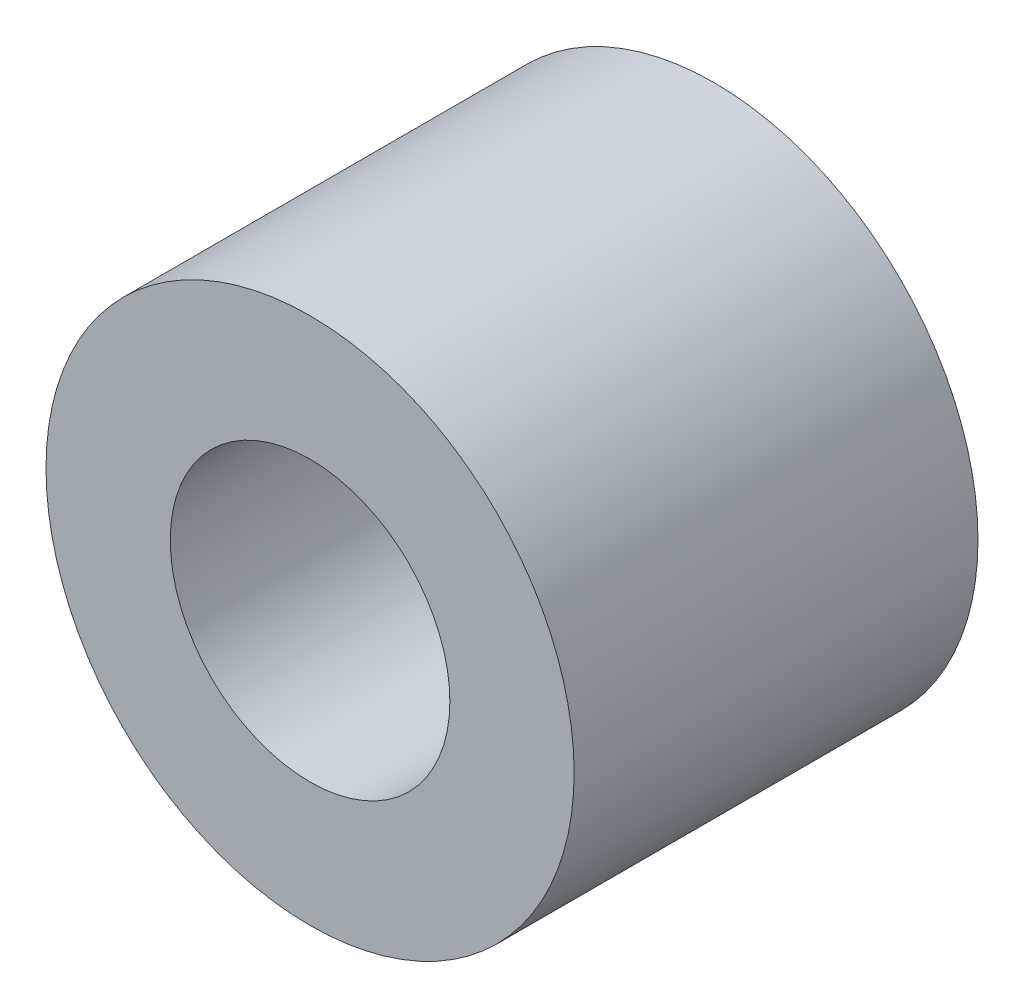
ISO-10303-21;
HEADER;
FILE_DESCRIPTION(('STEP AP214'),'2;1');
FILE_NAME('part.step','',(''),(''),'','','');
FILE_SCHEMA(('AUTOMOTIVE_DESIGN { 1 0 10303 214 1 1 1 1 }'));
ENDSEC;
DATA;
#1=APPLICATION_CONTEXT('core data for automotive mechanical design processes');
#2=APPLICATION_PROTOCOL_DEFINITION('international standard','automotive_design',2000,#1);
#3=PRODUCT_CONTEXT('',#1,'mechanical');
#4=PRODUCT('Part','Part','',(#3));
#5=PRODUCT_RELATED_PRODUCT_CATEGORY('part','',(#4));
#6=PRODUCT_DEFINITION_FORMATION('','',#4);
#7=PRODUCT_DEFINITION_CONTEXT('part definition',#1,'design');
#8=PRODUCT_DEFINITION('design','',#6,#7);
#9=PRODUCT_DEFINITION_SHAPE('','',#8);
#10=(LENGTH_UNIT() NAMED_UNIT(*) SI_UNIT(.MILLI.,.METRE.));
#11=(NAMED_UNIT(*) PLANE_ANGLE_UNIT() SI_UNIT($,.RADIAN.));
#12=(NAMED_UNIT(*) SI_UNIT($,.STERADIAN.) SOLID_ANGLE_UNIT());
#13=UNCERTAINTY_MEASURE_WITH_UNIT(LENGTH_MEASURE(1.E-05),#10,'distance_accuracy_value','');
#14=(GEOMETRIC_REPRESENTATION_CONTEXT(3) GLOBAL_UNCERTAINTY_ASSIGNED_CONTEXT((#13)) GLOBAL_UNIT_ASSIGNED_CONTEXT((#10,
#11,#12)) REPRESENTATION_CONTEXT('',''));
#15=CARTESIAN_POINT('',(0.,0.,0.));
#16=DIRECTION('',(0.,0.,1.));
#17=DIRECTION('',(1.,0.,0.));
#18=AXIS2_PLACEMENT_3D('',#15,#16,#17);
#19=CARTESIAN_POINT('',(0.,0.,13.));
#20=DIRECTION('',(0.,0.,-1.));
#21=DIRECTION('',(-1.,0.,0.));
#22=AXIS2_PLACEMENT_3D('',#19,#20,#21);
#23=CYLINDRICAL_SURFACE('',#22,8.5);
#24=CARTESIAN_POINT('',(0.,0.,13.));
#25=DIRECTION('',(0.,0.,1.));
#26=DIRECTION('',(1.,0.,0.));
#27=AXIS2_PLACEMENT_3D('',#24,#25,#26);
#28=CIRCLE('',#27,8.5);
#29=CARTESIAN_POINT('',(-8.5,0.,13.));
#30=VERTEX_POINT('',#29);
#31=EDGE_CURVE('E10',#30,#30,#28,.T.);
#32=CARTESIAN_POINT('',(0.,0.,0.));
#33=DIRECTION('',(0.,0.,1.));
#34=DIRECTION('',(1.,0.,0.));
#35=AXIS2_PLACEMENT_3D('',#32,#33,#34);
#36=CIRCLE('',#35,8.5);
#37=CARTESIAN_POINT('',(-8.5,0.,0.));
#38=VERTEX_POINT('',#37);
#39=EDGE_CURVE('E50',#38,#38,#36,.T.);
#40=CARTESIAN_POINT('',(-8.5,0.,13.));
#41=CARTESIAN_POINT('',(-8.5,0.,12.8645833333333));
#42=CARTESIAN_POINT('',(-8.5,0.,12.7291666666667));
#43=CARTESIAN_POINT('',(-8.5,0.,12.4583333333333));
#44=CARTESIAN_POINT('',(-8.5,0.,12.3229166666667));
#45=CARTESIAN_POINT('',(-8.5,0.,12.0520833333333));
#46=CARTESIAN_POINT('',(-8.5,0.,11.9166666666667));
#47=CARTESIAN_POINT('',(-8.5,0.,11.6458333333333));
#48=CARTESIAN_POINT('',(-8.5,0.,11.5104166666667));
#49=CARTESIAN_POINT('',(-8.5,0.,11.2395833333333));
#50=CARTESIAN_POINT('',(-8.5,0.,11.1041666666667));
#51=CARTESIAN_POINT('',(-8.5,0.,10.8333333333333));
#52=CARTESIAN_POINT('',(-8.5,0.,10.6979166666667));
#53=CARTESIAN_POINT('',(-8.5,0.,10.4270833333333));
#54=CARTESIAN_POINT('',(-8.5,0.,10.2916666666667));
#55=CARTESIAN_POINT('',(-8.5,0.,10.0208333333333));
#56=CARTESIAN_POINT('',(-8.5,0.,9.88541666666667));
#57=CARTESIAN_POINT('',(-8.5,0.,9.61458333333333));
#58=CARTESIAN_POINT('',(-8.5,0.,9.47916666666667));
#59=CARTESIAN_POINT('',(-8.5,0.,9.20833333333333));
#60=CARTESIAN_POINT('',(-8.5,0.,9.07291666666666));
#61=CARTESIAN_POINT('',(-8.5,0.,8.80208333333333));
#62=CARTESIAN_POINT('',(-8.5,0.,8.66666666666667));
#63=CARTESIAN_POINT('',(-8.5,0.,8.39583333333333));
#64=CARTESIAN_POINT('',(-8.5,0.,8.26041666666667));
#65=CARTESIAN_POINT('',(-8.5,0.,7.98958333333333));
#66=CARTESIAN_POINT('',(-8.5,0.,7.85416666666667));
#67=CARTESIAN_POINT('',(-8.5,0.,7.58333333333333));
#68=CARTESIAN_POINT('',(-8.5,0.,7.44791666666667));
#69=CARTESIAN_POINT('',(-8.5,0.,7.17708333333333));
#70=CARTESIAN_POINT('',(-8.5,0.,7.04166666666667));
#71=CARTESIAN_POINT('',(-8.5,0.,6.77083333333333));
#72=CARTESIAN_POINT('',(-8.5,0.,6.63541666666667));
#73=CARTESIAN_POINT('',(-8.5,0.,6.36458333333333));
#74=CARTESIAN_POINT('',(-8.5,0.,6.22916666666667));
#75=CARTESIAN_POINT('',(-8.5,0.,5.95833333333333));
#76=CARTESIAN_POINT('',(-8.5,0.,5.82291666666667));
#77=CARTESIAN_POINT('',(-8.5,0.,5.55208333333333));
#78=CARTESIAN_POINT('',(-8.5,0.,5.41666666666667));
#79=CARTESIAN_POINT('',(-8.5,0.,5.14583333333333));
#80=CARTESIAN_POINT('',(-8.5,0.,5.01041666666667));
#81=CARTESIAN_POINT('',(-8.5,0.,4.73958333333333));
#82=CARTESIAN_POINT('',(-8.5,0.,4.60416666666667));
#83=CARTESIAN_POINT('',(-8.5,0.,4.33333333333333));
#84=CARTESIAN_POINT('',(-8.5,0.,4.19791666666667));
#85=CARTESIAN_POINT('',(-8.5,0.,3.92708333333333));
#86=CARTESIAN_POINT('',(-8.5,0.,3.79166666666667));
#87=CARTESIAN_POINT('',(-8.5,0.,3.52083333333333));
#88=CARTESIAN_POINT('',(-8.5,0.,3.38541666666667));
#89=CARTESIAN_POINT('',(-8.5,0.,3.11458333333333));
#90=CARTESIAN_POINT('',(-8.5,0.,2.97916666666667));
#91=CARTESIAN_POINT('',(-8.5,0.,2.70833333333333));
#92=CARTESIAN_POINT('',(-8.5,0.,2.57291666666667));
#93=CARTESIAN_POINT('',(-8.5,0.,2.30208333333333));
#94=CARTESIAN_POINT('',(-8.5,0.,2.16666666666667));
#95=CARTESIAN_POINT('',(-8.5,0.,1.89583333333333));
#96=CARTESIAN_POINT('',(-8.5,0.,1.76041666666667));
#97=CARTESIAN_POINT('',(-8.5,0.,1.48958333333333));
#98=CARTESIAN_POINT('',(-8.5,0.,1.35416666666667));
#99=CARTESIAN_POINT('',(-8.5,0.,1.08333333333333));
#100=CARTESIAN_POINT('',(-8.5,0.,0.947916666666667));
#101=CARTESIAN_POINT('',(-8.5,0.,0.677083333333334));
#102=CARTESIAN_POINT('',(-8.5,0.,0.541666666666667));
#103=CARTESIAN_POINT('',(-8.5,0.,0.270833333333334));
#104=CARTESIAN_POINT('',(-8.5,0.,0.135416666666667));
#105=CARTESIAN_POINT('',(-8.5,0.,0.));
#106=B_SPLINE_CURVE_WITH_KNOTS('',3,(#40,#41,#42,#43,#44,#45,#46,#47,#48,#49,#50,#51,#52,#53,
#54,#55,#56,#57,#58,#59,#60,#61,#62,#63,#64,#65,#66,#67,#68,#69,#70,#71,#72,#73,#74,#75,#76,#77,
#78,#79,#80,#81,#82,#83,#84,#85,#86,#87,#88,#89,#90,#91,#92,#93,#94,#95,#96,#97,#98,#99,#100,
#101,#102,#103,#104,#105),.UNSPECIFIED.,.F.,.F.,(4,2,2,2,2,2,2,2,2,2,2,2,2,2,2,2,2,2,2,2,2,2,2,
2,2,2,2,2,2,2,2,2,4),(0.,0.40625,0.812500000000001,1.21875,1.625,2.03125,2.4375,2.84375,3.25,
3.65625,4.0625,4.46875,4.875,5.28125,5.6875,6.09375,6.5,6.90625,7.3125,7.71875,8.125,8.53125,
8.9375,9.34375,9.75,10.15625,10.5625,10.96875,11.375,11.78125,12.1875,12.59375,13.),.UNSPECIFIED.);
#107=EDGE_CURVE('BSEAM42',#30,#38,#106,.T.);
#108=ORIENTED_EDGE('',*,*,#31,.F.);
#109=ORIENTED_EDGE('',*,*,#39,.T.);
#110=ORIENTED_EDGE('',*,*,#107,.T.);
#111=ORIENTED_EDGE('',*,*,#107,.F.);
#112=EDGE_LOOP('',(#108,#110,#109,#111));
#113=FACE_BOUND('',#112,.T.);
#114=ADVANCED_FACE('F42',(#113),#23,.T.);
#115=CARTESIAN_POINT('',(0.,0.,13.));
#116=DIRECTION('',(0.,0.,1.));
#117=DIRECTION('',(1.,0.,0.));
#118=AXIS2_PLACEMENT_3D('',#115,#116,#117);
#119=PLANE('',#118);
#120=CARTESIAN_POINT('',(0.,0.,13.));
#121=DIRECTION('',(0.,0.,1.));
#122=DIRECTION('',(1.,0.,0.));
#123=AXIS2_PLACEMENT_3D('',#120,#121,#122);
#124=CIRCLE('',#123,4.5);
#125=CARTESIAN_POINT('',(4.5,0.,13.));
#126=VERTEX_POINT('',#125);
#127=EDGE_CURVE('E57',#126,#126,#124,.T.);
#128=ORIENTED_EDGE('',*,*,#127,.F.);
#129=EDGE_LOOP('',(#128));
#130=FACE_BOUND('',#129,.T.);
#131=ORIENTED_EDGE('',*,*,#31,.T.);
#132=EDGE_LOOP('',(#131));
#133=FACE_BOUND('',#132,.T.);
#134=ADVANCED_FACE('F75',(#130,#133),#119,.T.);
#135=CARTESIAN_POINT('',(0.,0.,0.));
#136=DIRECTION('',(0.,0.,1.));
#137=DIRECTION('',(1.,0.,0.));
#138=AXIS2_PLACEMENT_3D('',#135,#136,#137);
#139=PLANE('',#138);
#140=CARTESIAN_POINT('',(0.,0.,0.));
#141=DIRECTION('',(0.,0.,1.));
#142=DIRECTION('',(1.,0.,0.));
#143=AXIS2_PLACEMENT_3D('',#140,#141,#142);
#144=CIRCLE('',#143,4.5);
#145=CARTESIAN_POINT('',(4.5,0.,0.));
#146=VERTEX_POINT('',#145);
#147=EDGE_CURVE('E45',#146,#146,#144,.T.);
#148=ORIENTED_EDGE('',*,*,#147,.T.);
#149=EDGE_LOOP('',(#148));
#150=FACE_BOUND('',#149,.T.);
#151=ORIENTED_EDGE('',*,*,#39,.F.);
#152=EDGE_LOOP('',(#151));
#153=FACE_BOUND('',#152,.T.);
#154=ADVANCED_FACE('F66',(#150,#153),#139,.F.);
#155=CARTESIAN_POINT('',(0.,0.,-3.));
#156=DIRECTION('',(0.,0.,1.));
#157=DIRECTION('',(1.,0.,0.));
#158=AXIS2_PLACEMENT_3D('',#155,#156,#157);
#159=CYLINDRICAL_SURFACE('',#158,4.5);
#160=ORIENTED_EDGE('',*,*,#127,.T.);
#161=EDGE_LOOP('',(#160));
#162=FACE_BOUND('',#161,.T.);
#163=ORIENTED_EDGE('',*,*,#147,.F.);
#164=EDGE_LOOP('',(#163));
#165=FACE_BOUND('',#164,.T.);
#166=ADVANCED_FACE('F69',(#162,#165),#159,.F.);
#167=CLOSED_SHELL('',(#114,#134,#154,#166));
#168=MANIFOLD_SOLID_BREP('B2',#167);
#169=ADVANCED_BREP_SHAPE_REPRESENTATION('',(#18,#168),#14);
#170=SHAPE_DEFINITION_REPRESENTATION(#9,#169);
ENDSEC;
END-ISO-10303-21;
